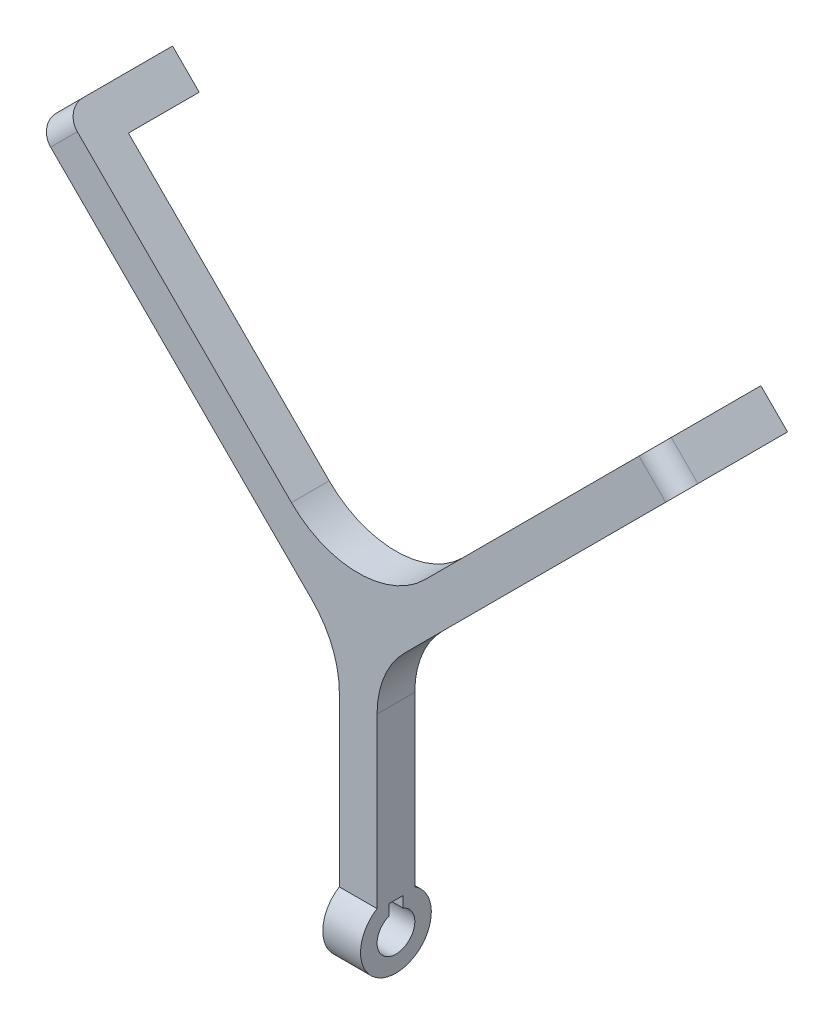
ISO-10303-21;
HEADER;
FILE_DESCRIPTION(('STEP AP214'),'2;1');
FILE_NAME('part.step','',(''),(''),'','','');
FILE_SCHEMA(('AUTOMOTIVE_DESIGN { 1 0 10303 214 1 1 1 1 }'));
ENDSEC;
DATA;
#1=APPLICATION_CONTEXT('core data for automotive mechanical design processes');
#2=APPLICATION_PROTOCOL_DEFINITION('international standard','automotive_design',2000,#1);
#3=PRODUCT_CONTEXT('',#1,'mechanical');
#4=PRODUCT('Part','Part','',(#3));
#5=PRODUCT_RELATED_PRODUCT_CATEGORY('part','',(#4));
#6=PRODUCT_DEFINITION_FORMATION('','',#4);
#7=PRODUCT_DEFINITION_CONTEXT('part definition',#1,'design');
#8=PRODUCT_DEFINITION('design','',#6,#7);
#9=PRODUCT_DEFINITION_SHAPE('','',#8);
#10=(LENGTH_UNIT() NAMED_UNIT(*) SI_UNIT(.MILLI.,.METRE.));
#11=(NAMED_UNIT(*) PLANE_ANGLE_UNIT() SI_UNIT($,.RADIAN.));
#12=(NAMED_UNIT(*) SI_UNIT($,.STERADIAN.) SOLID_ANGLE_UNIT());
#13=UNCERTAINTY_MEASURE_WITH_UNIT(LENGTH_MEASURE(1.E-05),#10,'distance_accuracy_value','');
#14=(GEOMETRIC_REPRESENTATION_CONTEXT(3) GLOBAL_UNCERTAINTY_ASSIGNED_CONTEXT((#13)) GLOBAL_UNIT_ASSIGNED_CONTEXT((#10,
#11,#12)) REPRESENTATION_CONTEXT('',''));
#15=CARTESIAN_POINT('',(0.,0.,0.));
#16=DIRECTION('',(0.,0.,1.));
#17=DIRECTION('',(1.,0.,0.));
#18=AXIS2_PLACEMENT_3D('',#15,#16,#17);
#19=CARTESIAN_POINT('',(0.,0.,0.));
#20=DIRECTION('',(0.,0.,-1.));
#21=DIRECTION('',(-1.,0.,0.));
#22=AXIS2_PLACEMENT_3D('',#19,#20,#21);
#23=PLANE('',#22);
#24=DIRECTION('',(-1.,0.,0.));
#25=VECTOR('',#24,1.);
#26=CARTESIAN_POINT('',(93.2132034355964,6.34428877022476,0.));
#27=LINE('',#26,#25);
#28=CARTESIAN_POINT('',(64.,6.34428877022476,0.));
#29=VERTEX_POINT('',#28);
#30=CARTESIAN_POINT('',(72.,6.34428877022476,0.));
#31=VERTEX_POINT('',#30);
#32=EDGE_CURVE('E245',#29,#31,#27,.F.);
#33=ORIENTED_EDGE('',*,*,#32,.F.);
#34=DIRECTION('',(0.,-1.,0.));
#35=VECTOR('',#34,1.);
#36=CARTESIAN_POINT('',(64.,0.,0.));
#37=LINE('',#36,#35);
#38=CARTESIAN_POINT('',(64.,42.0588745030459,0.));
#39=VERTEX_POINT('',#38);
#40=EDGE_CURVE('E305',#39,#29,#37,.T.);
#41=ORIENTED_EDGE('',*,*,#40,.F.);
#42=CARTESIAN_POINT('',(44.,42.0588745030459,0.));
#43=DIRECTION('',(0.,0.,-1.));
#44=DIRECTION('',(-1.,0.,0.));
#45=AXIS2_PLACEMENT_3D('',#42,#43,#44);
#46=CIRCLE('',#45,20.);
#47=CARTESIAN_POINT('',(58.1421356237309,56.2010101267769,0.));
#48=VERTEX_POINT('',#47);
#49=EDGE_CURVE('E384',#39,#48,#46,.F.);
#50=ORIENTED_EDGE('',*,*,#49,.T.);
#51=DIRECTION('',(0.707106781186549,-0.707106781186546,0.));
#52=VECTOR('',#51,1.);
#53=CARTESIAN_POINT('',(64.,50.3431457505079,0.));
#54=LINE('',#53,#52);
#55=CARTESIAN_POINT('',(5.6568542494924,108.686291501015,0.));
#56=VERTEX_POINT('',#55);
#57=EDGE_CURVE('E335',#56,#48,#54,.T.);
#58=ORIENTED_EDGE('',*,*,#57,.F.);
#59=DIRECTION('',(-0.707106781186547,-0.707106781186548,0.));
#60=VECTOR('',#59,1.);
#61=CARTESIAN_POINT('',(11.3137084989847,114.343145750508,0.));
#62=LINE('',#61,#60);
#63=CARTESIAN_POINT('',(11.3137084989847,114.343145750508,0.));
#64=VERTEX_POINT('',#63);
#65=EDGE_CURVE('E249',#64,#56,#62,.T.);
#66=ORIENTED_EDGE('',*,*,#65,.F.);
#67=DIRECTION('',(-0.707106781186546,0.707106781186549,0.));
#68=VECTOR('',#67,1.);
#69=CARTESIAN_POINT('',(5.65685424949236,120.,0.));
#70=LINE('',#69,#68);
#71=CARTESIAN_POINT('',(53.857864376269,71.7989898732232,0.));
#72=VERTEX_POINT('',#71);
#73=EDGE_CURVE('E332',#72,#64,#70,.T.);
#74=ORIENTED_EDGE('',*,*,#73,.F.);
#75=CARTESIAN_POINT('',(68.,85.9411254969541,0.));
#76=DIRECTION('',(0.,0.,-1.));
#77=DIRECTION('',(-1.,0.,0.));
#78=AXIS2_PLACEMENT_3D('',#75,#76,#77);
#79=CIRCLE('',#78,20.);
#80=CARTESIAN_POINT('',(82.142135623731,71.7989898732232,0.));
#81=VERTEX_POINT('',#80);
#82=EDGE_CURVE('E390',#72,#81,#79,.F.);
#83=ORIENTED_EDGE('',*,*,#82,.T.);
#84=DIRECTION('',(-0.707106781186546,-0.707106781186549,0.));
#85=VECTOR('',#84,1.);
#86=CARTESIAN_POINT('',(68.,57.6568542494922,0.));
#87=LINE('',#86,#85);
#88=CARTESIAN_POINT('',(124.686291501015,114.343145750508,0.));
#89=VERTEX_POINT('',#88);
#90=EDGE_CURVE('E328',#89,#81,#87,.T.);
#91=ORIENTED_EDGE('',*,*,#90,.F.);
#92=DIRECTION('',(-0.70710678118655,0.707106781186545,0.));
#93=VECTOR('',#92,1.);
#94=CARTESIAN_POINT('',(130.343145750508,108.686291501015,0.));
#95=LINE('',#94,#93);
#96=CARTESIAN_POINT('',(130.343145750508,108.686291501015,0.));
#97=VERTEX_POINT('',#96);
#98=EDGE_CURVE('E274',#97,#89,#95,.T.);
#99=ORIENTED_EDGE('',*,*,#98,.F.);
#100=DIRECTION('',(0.707106781186549,0.707106781186546,0.));
#101=VECTOR('',#100,1.);
#102=CARTESIAN_POINT('',(136.,114.343145750508,0.));
#103=LINE('',#102,#101);
#104=CARTESIAN_POINT('',(77.8578643762691,56.2010101267769,0.));
#105=VERTEX_POINT('',#104);
#106=EDGE_CURVE('E325',#105,#97,#103,.T.);
#107=ORIENTED_EDGE('',*,*,#106,.F.);
#108=CARTESIAN_POINT('',(92.,42.0588745030459,0.));
#109=DIRECTION('',(0.,0.,-1.));
#110=DIRECTION('',(-1.,0.,0.));
#111=AXIS2_PLACEMENT_3D('',#108,#109,#110);
#112=CIRCLE('',#111,20.);
#113=CARTESIAN_POINT('',(72.,42.0588745030459,0.));
#114=VERTEX_POINT('',#113);
#115=EDGE_CURVE('E377',#105,#114,#112,.F.);
#116=ORIENTED_EDGE('',*,*,#115,.T.);
#117=DIRECTION('',(0.,1.,0.));
#118=VECTOR('',#117,1.);
#119=CARTESIAN_POINT('',(72.,50.3431457505078,0.));
#120=LINE('',#119,#118);
#121=EDGE_CURVE('E300',#31,#114,#120,.T.);
#122=ORIENTED_EDGE('',*,*,#121,.F.);
#123=EDGE_LOOP('',(#33,#41,#50,#58,#66,#74,#83,#91,#99,#107,#116,#122));
#124=FACE_BOUND('',#123,.T.);
#125=ADVANCED_FACE('F39',(#124),#23,.T.);
#126=CARTESIAN_POINT('',(72.,50.3431457505078,8.));
#127=DIRECTION('',(-1.,0.,0.));
#128=DIRECTION('',(0.,-1.,0.));
#129=AXIS2_PLACEMENT_3D('',#126,#127,#128);
#130=PLANE('',#129);
#131=DIRECTION('',(0.,-1.,0.));
#132=VECTOR('',#131,1.);
#133=CARTESIAN_POINT('',(72.,50.3431457505078,2.50000000000001));
#134=LINE('',#133,#132);
#135=CARTESIAN_POINT('',(72.,6.,2.5));
#136=VERTEX_POINT('',#135);
#137=CARTESIAN_POINT('',(72.,3.70809924354783,2.5));
#138=VERTEX_POINT('',#137);
#139=EDGE_CURVE('E229',#136,#138,#134,.T.);
#140=ORIENTED_EDGE('',*,*,#139,.T.);
#141=CARTESIAN_POINT('',(72.,0.,4.));
#142=DIRECTION('',(-1.,0.,0.));
#143=DIRECTION('',(0.,-1.,0.));
#144=AXIS2_PLACEMENT_3D('',#141,#142,#143);
#145=CIRCLE('',#144,4.);
#146=CARTESIAN_POINT('',(72.,3.70809924354783,5.5));
#147=VERTEX_POINT('',#146);
#148=EDGE_CURVE('E233',#138,#147,#145,.T.);
#149=ORIENTED_EDGE('',*,*,#148,.T.);
#150=DIRECTION('',(0.,1.,0.));
#151=VECTOR('',#150,1.);
#152=CARTESIAN_POINT('',(72.,50.3431457505078,5.5));
#153=LINE('',#152,#151);
#154=CARTESIAN_POINT('',(72.,6.,5.5));
#155=VERTEX_POINT('',#154);
#156=EDGE_CURVE('E220',#147,#155,#153,.T.);
#157=ORIENTED_EDGE('',*,*,#156,.T.);
#158=DIRECTION('',(0.,0.,-1.));
#159=VECTOR('',#158,1.);
#160=CARTESIAN_POINT('',(72.,6.,8.));
#161=LINE('',#160,#159);
#162=EDGE_CURVE('E195',#155,#136,#161,.T.);
#163=ORIENTED_EDGE('',*,*,#162,.T.);
#164=EDGE_LOOP('',(#140,#149,#157,#163));
#165=FACE_BOUND('',#164,.T.);
#166=CARTESIAN_POINT('',(72.,0.,4.));
#167=DIRECTION('',(-1.,0.,0.));
#168=DIRECTION('',(0.,-1.,0.));
#169=AXIS2_PLACEMENT_3D('',#166,#167,#168);
#170=CIRCLE('',#169,7.5);
#171=CARTESIAN_POINT('',(72.,6.34428877022476,8.));
#172=VERTEX_POINT('',#171);
#173=EDGE_CURVE('E241',#172,#31,#170,.F.);
#174=ORIENTED_EDGE('',*,*,#173,.T.);
#175=ORIENTED_EDGE('',*,*,#121,.T.);
#176=DIRECTION('',(0.,0.,-1.));
#177=VECTOR('',#176,1.);
#178=CARTESIAN_POINT('',(72.,42.0588745030459,8.));
#179=LINE('',#178,#177);
#180=CARTESIAN_POINT('',(72.,42.0588745030459,8.));
#181=VERTEX_POINT('',#180);
#182=EDGE_CURVE('E357',#114,#181,#179,.F.);
#183=ORIENTED_EDGE('',*,*,#182,.T.);
#184=DIRECTION('',(0.,1.,0.));
#185=VECTOR('',#184,1.);
#186=CARTESIAN_POINT('',(72.,50.3431457505078,8.));
#187=LINE('',#186,#185);
#188=EDGE_CURVE('E301',#172,#181,#187,.T.);
#189=ORIENTED_EDGE('',*,*,#188,.F.);
#190=EDGE_LOOP('',(#174,#175,#183,#189));
#191=FACE_BOUND('',#190,.T.);
#192=ADVANCED_FACE('F464',(#165,#191),#130,.F.);
#193=CARTESIAN_POINT('',(136.,114.343145750508,8.));
#194=DIRECTION('',(-0.707106781186546,0.707106781186549,0.));
#195=DIRECTION('',(-0.707106781186549,-0.707106781186546,0.));
#196=AXIS2_PLACEMENT_3D('',#193,#194,#195);
#197=PLANE('',#196);
#198=DIRECTION('',(0.,0.,-1.));
#199=VECTOR('',#198,1.);
#200=CARTESIAN_POINT('',(136.,114.343145750508,8.));
#201=LINE('',#200,#199);
#202=CARTESIAN_POINT('',(136.,114.343145750508,4.));
#203=VERTEX_POINT('',#202);
#204=CARTESIAN_POINT('',(136.,114.343145750508,-15.));
#205=VERTEX_POINT('',#204);
#206=EDGE_CURVE('E350',#203,#205,#201,.T.);
#207=ORIENTED_EDGE('',*,*,#206,.F.);
#208=CARTESIAN_POINT('',(133.171572875254,111.514718625761,4.));
#209=DIRECTION('',(-0.707106781186546,0.707106781186549,0.));
#210=DIRECTION('',(-0.707106781186549,-0.707106781186546,0.));
#211=AXIS2_PLACEMENT_3D('',#208,#209,#210);
#212=CIRCLE('',#211,4.);
#213=CARTESIAN_POINT('',(133.171572875254,111.514718625761,8.));
#214=VERTEX_POINT('',#213);
#215=EDGE_CURVE('E410',#203,#214,#212,.F.);
#216=ORIENTED_EDGE('',*,*,#215,.T.);
#217=DIRECTION('',(0.707106781186549,0.707106781186546,0.));
#218=VECTOR('',#217,1.);
#219=CARTESIAN_POINT('',(136.,114.343145750508,8.));
#220=LINE('',#219,#218);
#221=CARTESIAN_POINT('',(77.8578643762691,56.2010101267769,8.));
#222=VERTEX_POINT('',#221);
#223=EDGE_CURVE('E304',#222,#214,#220,.T.);
#224=ORIENTED_EDGE('',*,*,#223,.F.);
#225=DIRECTION('',(0.,0.,-1.));
#226=VECTOR('',#225,1.);
#227=CARTESIAN_POINT('',(77.8578643762691,56.2010101267769,0.));
#228=LINE('',#227,#226);
#229=EDGE_CURVE('E353',#222,#105,#228,.T.);
#230=ORIENTED_EDGE('',*,*,#229,.T.);
#231=ORIENTED_EDGE('',*,*,#106,.T.);
#232=DIRECTION('',(0.,0.,1.));
#233=VECTOR('',#232,1.);
#234=CARTESIAN_POINT('',(130.343145750508,108.686291501015,-15.));
#235=LINE('',#234,#233);
#236=CARTESIAN_POINT('',(130.343145750508,108.686291501015,-15.));
#237=VERTEX_POINT('',#236);
#238=EDGE_CURVE('E296',#237,#97,#235,.T.);
#239=ORIENTED_EDGE('',*,*,#238,.F.);
#240=DIRECTION('',(-0.707106781186552,-0.707106781186543,0.));
#241=VECTOR('',#240,1.);
#242=CARTESIAN_POINT('',(130.343145750508,108.686291501015,-15.));
#243=LINE('',#242,#241);
#244=EDGE_CURVE('E279',#205,#237,#243,.T.);
#245=ORIENTED_EDGE('',*,*,#244,.F.);
#246=EDGE_LOOP('',(#207,#216,#224,#230,#231,#239,#245));
#247=FACE_BOUND('',#246,.T.);
#248=ADVANCED_FACE('F473',(#247),#197,.F.);
#249=CARTESIAN_POINT('',(130.343145750508,120.,8.));
#250=DIRECTION('',(-0.707106781186547,-0.707106781186548,0.));
#251=DIRECTION('',(0.707106781186548,-0.707106781186547,0.));
#252=AXIS2_PLACEMENT_3D('',#249,#250,#251);
#253=PLANE('',#252);
#254=DIRECTION('',(0.,0.,-1.));
#255=VECTOR('',#254,1.);
#256=CARTESIAN_POINT('',(130.343145750508,120.,8.));
#257=LINE('',#256,#255);
#258=CARTESIAN_POINT('',(130.343145750508,120.,4.));
#259=VERTEX_POINT('',#258);
#260=CARTESIAN_POINT('',(130.343145750508,120.,-15.));
#261=VERTEX_POINT('',#260);
#262=EDGE_CURVE('E347',#259,#261,#257,.T.);
#263=ORIENTED_EDGE('',*,*,#262,.F.);
#264=DIRECTION('',(-0.707106781186548,0.707106781186547,0.));
#265=VECTOR('',#264,1.);
#266=CARTESIAN_POINT('',(130.343145750508,120.,4.));
#267=LINE('',#266,#265);
#268=EDGE_CURVE('E407',#259,#203,#267,.F.);
#269=ORIENTED_EDGE('',*,*,#268,.T.);
#270=ORIENTED_EDGE('',*,*,#206,.T.);
#271=DIRECTION('',(0.707106781186548,-0.707106781186547,0.));
#272=VECTOR('',#271,1.);
#273=CARTESIAN_POINT('',(136.,114.343145750508,-15.));
#274=LINE('',#273,#272);
#275=EDGE_CURVE('E275',#261,#205,#274,.T.);
#276=ORIENTED_EDGE('',*,*,#275,.F.);
#277=EDGE_LOOP('',(#263,#269,#270,#276));
#278=FACE_BOUND('',#277,.T.);
#279=ADVANCED_FACE('F490',(#278),#253,.F.);
#280=CARTESIAN_POINT('',(68.,57.6568542494922,8.));
#281=DIRECTION('',(0.707106781186549,-0.707106781186546,0.));
#282=DIRECTION('',(0.707106781186546,0.707106781186549,0.));
#283=AXIS2_PLACEMENT_3D('',#280,#281,#282);
#284=PLANE('',#283);
#285=DIRECTION('',(-0.707106781186546,-0.707106781186549,0.));
#286=VECTOR('',#285,1.);
#287=CARTESIAN_POINT('',(68.,57.6568542494922,8.));
#288=LINE('',#287,#286);
#289=CARTESIAN_POINT('',(127.514718625761,117.171572875254,8.));
#290=VERTEX_POINT('',#289);
#291=CARTESIAN_POINT('',(82.142135623731,71.7989898732232,8.));
#292=VERTEX_POINT('',#291);
#293=EDGE_CURVE('E309',#290,#292,#288,.T.);
#294=ORIENTED_EDGE('',*,*,#293,.F.);
#295=CARTESIAN_POINT('',(127.514718625761,117.171572875254,4.));
#296=DIRECTION('',(0.707106781186549,-0.707106781186546,0.));
#297=DIRECTION('',(0.707106781186546,0.707106781186549,0.));
#298=AXIS2_PLACEMENT_3D('',#295,#296,#297);
#299=CIRCLE('',#298,4.);
#300=EDGE_CURVE('E404',#290,#259,#299,.F.);
#301=ORIENTED_EDGE('',*,*,#300,.T.);
#302=ORIENTED_EDGE('',*,*,#262,.T.);
#303=DIRECTION('',(0.707106781186547,0.707106781186548,0.));
#304=VECTOR('',#303,1.);
#305=CARTESIAN_POINT('',(130.343145750508,120.,-15.));
#306=LINE('',#305,#304);
#307=CARTESIAN_POINT('',(124.686291501015,114.343145750508,-15.));
#308=VERTEX_POINT('',#307);
#309=EDGE_CURVE('E285',#308,#261,#306,.T.);
#310=ORIENTED_EDGE('',*,*,#309,.F.);
#311=DIRECTION('',(0.,0.,1.));
#312=VECTOR('',#311,1.);
#313=CARTESIAN_POINT('',(124.686291501015,114.343145750508,-15.));
#314=LINE('',#313,#312);
#315=EDGE_CURVE('E289',#308,#89,#314,.T.);
#316=ORIENTED_EDGE('',*,*,#315,.T.);
#317=ORIENTED_EDGE('',*,*,#90,.T.);
#318=DIRECTION('',(0.,0.,-1.));
#319=VECTOR('',#318,1.);
#320=CARTESIAN_POINT('',(82.142135623731,71.7989898732232,8.));
#321=LINE('',#320,#319);
#322=EDGE_CURVE('E373',#81,#292,#321,.F.);
#323=ORIENTED_EDGE('',*,*,#322,.T.);
#324=EDGE_LOOP('',(#294,#301,#302,#310,#316,#317,#323));
#325=FACE_BOUND('',#324,.T.);
#326=ADVANCED_FACE('F496',(#325),#284,.F.);
#327=CARTESIAN_POINT('',(5.65685424949236,120.,8.));
#328=DIRECTION('',(-0.707106781186549,-0.707106781186546,0.));
#329=DIRECTION('',(0.707106781186546,-0.707106781186549,0.));
#330=AXIS2_PLACEMENT_3D('',#327,#328,#329);
#331=PLANE('',#330);
#332=DIRECTION('',(0.,0.,-1.));
#333=VECTOR('',#332,1.);
#334=CARTESIAN_POINT('',(5.65685424949236,120.,8.));
#335=LINE('',#334,#333);
#336=CARTESIAN_POINT('',(5.65685424949236,120.,4.));
#337=VERTEX_POINT('',#336);
#338=CARTESIAN_POINT('',(5.65685424949236,120.,-15.));
#339=VERTEX_POINT('',#338);
#340=EDGE_CURVE('E344',#337,#339,#335,.T.);
#341=ORIENTED_EDGE('',*,*,#340,.F.);
#342=CARTESIAN_POINT('',(8.48528137423853,117.171572875254,4.));
#343=DIRECTION('',(-0.707106781186549,-0.707106781186546,0.));
#344=DIRECTION('',(0.707106781186546,-0.707106781186549,0.));
#345=AXIS2_PLACEMENT_3D('',#342,#343,#344);
#346=CIRCLE('',#345,4.);
#347=CARTESIAN_POINT('',(8.48528137423854,117.171572875254,8.));
#348=VERTEX_POINT('',#347);
#349=EDGE_CURVE('E48',#337,#348,#346,.F.);
#350=ORIENTED_EDGE('',*,*,#349,.T.);
#351=DIRECTION('',(-0.707106781186546,0.707106781186549,0.));
#352=VECTOR('',#351,1.);
#353=CARTESIAN_POINT('',(5.65685424949236,120.,8.));
#354=LINE('',#353,#352);
#355=CARTESIAN_POINT('',(53.857864376269,71.7989898732232,8.));
#356=VERTEX_POINT('',#355);
#357=EDGE_CURVE('E312',#356,#348,#354,.T.);
#358=ORIENTED_EDGE('',*,*,#357,.F.);
#359=DIRECTION('',(0.,0.,-1.));
#360=VECTOR('',#359,1.);
#361=CARTESIAN_POINT('',(53.857864376269,71.7989898732232,0.));
#362=LINE('',#361,#360);
#363=EDGE_CURVE('E369',#356,#72,#362,.T.);
#364=ORIENTED_EDGE('',*,*,#363,.T.);
#365=ORIENTED_EDGE('',*,*,#73,.T.);
#366=DIRECTION('',(0.,0.,1.));
#367=VECTOR('',#366,1.);
#368=CARTESIAN_POINT('',(11.3137084989847,114.343145750508,-15.));
#369=LINE('',#368,#367);
#370=CARTESIAN_POINT('',(11.3137084989847,114.343145750508,-15.));
#371=VERTEX_POINT('',#370);
#372=EDGE_CURVE('E270',#371,#64,#369,.T.);
#373=ORIENTED_EDGE('',*,*,#372,.F.);
#374=DIRECTION('',(0.707106781186546,-0.707106781186549,0.));
#375=VECTOR('',#374,1.);
#376=CARTESIAN_POINT('',(11.3137084989847,114.343145750508,-15.));
#377=LINE('',#376,#375);
#378=EDGE_CURVE('E254',#339,#371,#377,.T.);
#379=ORIENTED_EDGE('',*,*,#378,.F.);
#380=EDGE_LOOP('',(#341,#350,#358,#364,#365,#373,#379));
#381=FACE_BOUND('',#380,.T.);
#382=ADVANCED_FACE('F423',(#381),#331,.F.);
#383=CARTESIAN_POINT('',(0.,114.343145750508,8.));
#384=DIRECTION('',(0.707106781186549,-0.707106781186546,0.));
#385=DIRECTION('',(0.707106781186546,0.707106781186549,0.));
#386=AXIS2_PLACEMENT_3D('',#383,#384,#385);
#387=PLANE('',#386);
#388=DIRECTION('',(0.,0.,-1.));
#389=VECTOR('',#388,1.);
#390=CARTESIAN_POINT('',(0.,114.343145750508,8.));
#391=LINE('',#390,#389);
#392=CARTESIAN_POINT('',(0.,114.343145750508,4.));
#393=VERTEX_POINT('',#392);
#394=CARTESIAN_POINT('',(0.,114.343145750508,-15.));
#395=VERTEX_POINT('',#394);
#396=EDGE_CURVE('E322',#393,#395,#391,.T.);
#397=ORIENTED_EDGE('',*,*,#396,.F.);
#398=DIRECTION('',(-0.707106781186546,-0.707106781186549,0.));
#399=VECTOR('',#398,1.);
#400=CARTESIAN_POINT('',(0.,114.343145750508,4.));
#401=LINE('',#400,#399);
#402=EDGE_CURVE('E416',#393,#337,#401,.F.);
#403=ORIENTED_EDGE('',*,*,#402,.T.);
#404=ORIENTED_EDGE('',*,*,#340,.T.);
#405=DIRECTION('',(0.707106781186546,0.707106781186549,0.));
#406=VECTOR('',#405,1.);
#407=CARTESIAN_POINT('',(5.65685424949236,120.,-15.));
#408=LINE('',#407,#406);
#409=EDGE_CURVE('E250',#395,#339,#408,.T.);
#410=ORIENTED_EDGE('',*,*,#409,.F.);
#411=EDGE_LOOP('',(#397,#403,#404,#410));
#412=FACE_BOUND('',#411,.T.);
#413=ADVANCED_FACE('F439',(#412),#387,.F.);
#414=CARTESIAN_POINT('',(64.,50.3431457505079,8.));
#415=DIRECTION('',(0.707106781186546,0.707106781186549,0.));
#416=DIRECTION('',(-0.707106781186549,0.707106781186546,0.));
#417=AXIS2_PLACEMENT_3D('',#414,#415,#416);
#418=PLANE('',#417);
#419=DIRECTION('',(0.707106781186549,-0.707106781186546,0.));
#420=VECTOR('',#419,1.);
#421=CARTESIAN_POINT('',(64.,50.3431457505079,8.));
#422=LINE('',#421,#420);
#423=CARTESIAN_POINT('',(2.8284271247462,111.514718625761,8.));
#424=VERTEX_POINT('',#423);
#425=CARTESIAN_POINT('',(58.1421356237309,56.2010101267769,8.));
#426=VERTEX_POINT('',#425);
#427=EDGE_CURVE('E316',#424,#426,#422,.T.);
#428=ORIENTED_EDGE('',*,*,#427,.F.);
#429=CARTESIAN_POINT('',(2.82842712474617,111.514718625761,4.));
#430=DIRECTION('',(0.707106781186546,0.707106781186549,0.));
#431=DIRECTION('',(-0.707106781186549,0.707106781186546,0.));
#432=AXIS2_PLACEMENT_3D('',#429,#430,#431);
#433=CIRCLE('',#432,4.);
#434=EDGE_CURVE('E413',#424,#393,#433,.F.);
#435=ORIENTED_EDGE('',*,*,#434,.T.);
#436=ORIENTED_EDGE('',*,*,#396,.T.);
#437=DIRECTION('',(-0.707106781186549,0.707106781186546,0.));
#438=VECTOR('',#437,1.);
#439=CARTESIAN_POINT('',(0.,114.343145750508,-15.));
#440=LINE('',#439,#438);
#441=CARTESIAN_POINT('',(5.65685424949238,108.686291501015,-15.));
#442=VERTEX_POINT('',#441);
#443=EDGE_CURVE('E260',#442,#395,#440,.T.);
#444=ORIENTED_EDGE('',*,*,#443,.F.);
#445=DIRECTION('',(0.,0.,1.));
#446=VECTOR('',#445,1.);
#447=CARTESIAN_POINT('',(5.65685424949238,108.686291501015,-15.));
#448=LINE('',#447,#446);
#449=EDGE_CURVE('E264',#442,#56,#448,.T.);
#450=ORIENTED_EDGE('',*,*,#449,.T.);
#451=ORIENTED_EDGE('',*,*,#57,.T.);
#452=DIRECTION('',(0.,0.,-1.));
#453=VECTOR('',#452,1.);
#454=CARTESIAN_POINT('',(58.1421356237309,56.2010101267769,8.));
#455=LINE('',#454,#453);
#456=EDGE_CURVE('E365',#48,#426,#455,.F.);
#457=ORIENTED_EDGE('',*,*,#456,.T.);
#458=EDGE_LOOP('',(#428,#435,#436,#444,#450,#451,#457));
#459=FACE_BOUND('',#458,.T.);
#460=ADVANCED_FACE('F435',(#459),#418,.F.);
#461=CARTESIAN_POINT('',(64.,0.,8.));
#462=DIRECTION('',(1.,0.,0.));
#463=DIRECTION('',(0.,0.,-1.));
#464=AXIS2_PLACEMENT_3D('',#461,#462,#463);
#465=PLANE('',#464);
#466=DIRECTION('',(0.,1.,0.));
#467=VECTOR('',#466,1.);
#468=CARTESIAN_POINT('',(64.,3.70809924354783,5.5));
#469=LINE('',#468,#467);
#470=CARTESIAN_POINT('',(64.,3.70809924354783,5.5));
#471=VERTEX_POINT('',#470);
#472=CARTESIAN_POINT('',(64.,6.,5.5));
#473=VERTEX_POINT('',#472);
#474=EDGE_CURVE('E202',#471,#473,#469,.T.);
#475=ORIENTED_EDGE('',*,*,#474,.F.);
#476=CARTESIAN_POINT('',(64.,0.,4.));
#477=DIRECTION('',(-1.,0.,0.));
#478=DIRECTION('',(0.,0.,1.));
#479=AXIS2_PLACEMENT_3D('',#476,#477,#478);
#480=CIRCLE('',#479,4.);
#481=CARTESIAN_POINT('',(64.,3.70809924354783,2.5));
#482=VERTEX_POINT('',#481);
#483=EDGE_CURVE('E63',#482,#471,#480,.T.);
#484=ORIENTED_EDGE('',*,*,#483,.F.);
#485=DIRECTION('',(0.,-1.,0.));
#486=VECTOR('',#485,1.);
#487=CARTESIAN_POINT('',(64.,3.70809924354783,2.5));
#488=LINE('',#487,#486);
#489=CARTESIAN_POINT('',(64.,6.,2.5));
#490=VERTEX_POINT('',#489);
#491=EDGE_CURVE('E210',#490,#482,#488,.T.);
#492=ORIENTED_EDGE('',*,*,#491,.F.);
#493=DIRECTION('',(0.,0.,-1.));
#494=VECTOR('',#493,1.);
#495=CARTESIAN_POINT('',(64.,6.,2.5));
#496=LINE('',#495,#494);
#497=EDGE_CURVE('E192',#473,#490,#496,.T.);
#498=ORIENTED_EDGE('',*,*,#497,.F.);
#499=EDGE_LOOP('',(#475,#484,#492,#498));
#500=FACE_BOUND('',#499,.T.);
#501=ORIENTED_EDGE('',*,*,#40,.T.);
#502=CARTESIAN_POINT('',(64.,0.,4.));
#503=DIRECTION('',(-1.,0.,0.));
#504=DIRECTION('',(0.,0.,1.));
#505=AXIS2_PLACEMENT_3D('',#502,#503,#504);
#506=CIRCLE('',#505,7.5);
#507=CARTESIAN_POINT('',(64.,6.34428877022476,8.));
#508=VERTEX_POINT('',#507);
#509=EDGE_CURVE('E237',#29,#508,#506,.T.);
#510=ORIENTED_EDGE('',*,*,#509,.T.);
#511=DIRECTION('',(0.,-1.,0.));
#512=VECTOR('',#511,1.);
#513=CARTESIAN_POINT('',(64.,0.,8.));
#514=LINE('',#513,#512);
#515=CARTESIAN_POINT('',(64.,42.0588745030459,8.));
#516=VERTEX_POINT('',#515);
#517=EDGE_CURVE('E319',#516,#508,#514,.T.);
#518=ORIENTED_EDGE('',*,*,#517,.F.);
#519=DIRECTION('',(0.,0.,-1.));
#520=VECTOR('',#519,1.);
#521=CARTESIAN_POINT('',(64.,42.0588745030459,0.));
#522=LINE('',#521,#520);
#523=EDGE_CURVE('E361',#516,#39,#522,.T.);
#524=ORIENTED_EDGE('',*,*,#523,.T.);
#525=EDGE_LOOP('',(#501,#510,#518,#524));
#526=FACE_BOUND('',#525,.T.);
#527=ADVANCED_FACE('F207',(#500,#526),#465,.F.);
#528=CARTESIAN_POINT('',(0.,0.,8.));
#529=DIRECTION('',(0.,0.,-1.));
#530=DIRECTION('',(-1.,0.,0.));
#531=AXIS2_PLACEMENT_3D('',#528,#529,#530);
#532=PLANE('',#531);
#533=ORIENTED_EDGE('',*,*,#517,.T.);
#534=DIRECTION('',(-1.,0.,0.));
#535=VECTOR('',#534,1.);
#536=CARTESIAN_POINT('',(93.2132034355964,6.34428877022476,8.));
#537=LINE('',#536,#535);
#538=EDGE_CURVE('E11',#508,#172,#537,.F.);
#539=ORIENTED_EDGE('',*,*,#538,.T.);
#540=ORIENTED_EDGE('',*,*,#188,.T.);
#541=CARTESIAN_POINT('',(92.,42.0588745030459,8.));
#542=DIRECTION('',(0.,0.,-1.));
#543=DIRECTION('',(-1.,0.,0.));
#544=AXIS2_PLACEMENT_3D('',#541,#542,#543);
#545=CIRCLE('',#544,20.);
#546=EDGE_CURVE('E381',#181,#222,#545,.T.);
#547=ORIENTED_EDGE('',*,*,#546,.T.);
#548=ORIENTED_EDGE('',*,*,#223,.T.);
#549=DIRECTION('',(-0.707106781186548,0.707106781186547,0.));
#550=VECTOR('',#549,1.);
#551=CARTESIAN_POINT('',(122.343145750507,122.343145750508,8.));
#552=LINE('',#551,#550);
#553=EDGE_CURVE('E400',#214,#290,#552,.T.);
#554=ORIENTED_EDGE('',*,*,#553,.T.);
#555=ORIENTED_EDGE('',*,*,#293,.T.);
#556=CARTESIAN_POINT('',(68.,85.9411254969541,8.));
#557=DIRECTION('',(0.,0.,-1.));
#558=DIRECTION('',(-1.,0.,0.));
#559=AXIS2_PLACEMENT_3D('',#556,#557,#558);
#560=CIRCLE('',#559,20.);
#561=EDGE_CURVE('E393',#292,#356,#560,.T.);
#562=ORIENTED_EDGE('',*,*,#561,.T.);
#563=ORIENTED_EDGE('',*,*,#357,.T.);
#564=DIRECTION('',(-0.707106781186546,-0.707106781186549,0.));
#565=VECTOR('',#564,1.);
#566=CARTESIAN_POINT('',(-54.3431457505076,54.3431457505074,8.));
#567=LINE('',#566,#565);
#568=EDGE_CURVE('E396',#348,#424,#567,.T.);
#569=ORIENTED_EDGE('',*,*,#568,.T.);
#570=ORIENTED_EDGE('',*,*,#427,.T.);
#571=CARTESIAN_POINT('',(44.,42.0588745030459,8.));
#572=DIRECTION('',(0.,0.,-1.));
#573=DIRECTION('',(-1.,0.,0.));
#574=AXIS2_PLACEMENT_3D('',#571,#572,#573);
#575=CIRCLE('',#574,20.);
#576=EDGE_CURVE('E387',#426,#516,#575,.T.);
#577=ORIENTED_EDGE('',*,*,#576,.T.);
#578=EDGE_LOOP('',(#533,#539,#540,#547,#548,#554,#555,#562,#563,#569,#570,#577));
#579=FACE_BOUND('',#578,.T.);
#580=ADVANCED_FACE('F430',(#579),#532,.F.);
#581=CARTESIAN_POINT('',(130.343145750508,108.686291501015,-15.));
#582=DIRECTION('',(0.707106781186545,0.70710678118655,0.));
#583=DIRECTION('',(-0.70710678118655,0.707106781186545,0.));
#584=AXIS2_PLACEMENT_3D('',#581,#582,#583);
#585=PLANE('',#584);
#586=ORIENTED_EDGE('',*,*,#98,.T.);
#587=ORIENTED_EDGE('',*,*,#315,.F.);
#588=DIRECTION('',(-0.70710678118655,0.707106781186545,0.));
#589=VECTOR('',#588,1.);
#590=CARTESIAN_POINT('',(130.343145750508,108.686291501015,-15.));
#591=LINE('',#590,#589);
#592=EDGE_CURVE('E282',#237,#308,#591,.T.);
#593=ORIENTED_EDGE('',*,*,#592,.F.);
#594=ORIENTED_EDGE('',*,*,#238,.T.);
#595=EDGE_LOOP('',(#586,#587,#593,#594));
#596=FACE_BOUND('',#595,.T.);
#597=ADVANCED_FACE('F483',(#596),#585,.F.);
#598=CARTESIAN_POINT('',(0.,0.,-15.));
#599=DIRECTION('',(0.,0.,1.));
#600=DIRECTION('',(1.,0.,0.));
#601=AXIS2_PLACEMENT_3D('',#598,#599,#600);
#602=PLANE('',#601);
#603=ORIENTED_EDGE('',*,*,#275,.T.);
#604=ORIENTED_EDGE('',*,*,#244,.T.);
#605=ORIENTED_EDGE('',*,*,#592,.T.);
#606=ORIENTED_EDGE('',*,*,#309,.T.);
#607=EDGE_LOOP('',(#603,#604,#605,#606));
#608=FACE_BOUND('',#607,.T.);
#609=ADVANCED_FACE('F486',(#608),#602,.F.);
#610=CARTESIAN_POINT('',(11.3137084989847,114.343145750508,-15.));
#611=DIRECTION('',(-0.707106781186548,0.707106781186547,0.));
#612=DIRECTION('',(-0.707106781186547,-0.707106781186548,0.));
#613=AXIS2_PLACEMENT_3D('',#610,#611,#612);
#614=PLANE('',#613);
#615=ORIENTED_EDGE('',*,*,#65,.T.);
#616=ORIENTED_EDGE('',*,*,#449,.F.);
#617=DIRECTION('',(-0.707106781186547,-0.707106781186548,0.));
#618=VECTOR('',#617,1.);
#619=CARTESIAN_POINT('',(11.3137084989847,114.343145750508,-15.));
#620=LINE('',#619,#618);
#621=EDGE_CURVE('E257',#371,#442,#620,.T.);
#622=ORIENTED_EDGE('',*,*,#621,.F.);
#623=ORIENTED_EDGE('',*,*,#372,.T.);
#624=EDGE_LOOP('',(#615,#616,#622,#623));
#625=FACE_BOUND('',#624,.T.);
#626=ADVANCED_FACE('F449',(#625),#614,.F.);
#627=CARTESIAN_POINT('',(0.,0.,-15.));
#628=DIRECTION('',(0.,0.,1.));
#629=DIRECTION('',(1.,0.,0.));
#630=AXIS2_PLACEMENT_3D('',#627,#628,#629);
#631=PLANE('',#630);
#632=ORIENTED_EDGE('',*,*,#409,.T.);
#633=ORIENTED_EDGE('',*,*,#378,.T.);
#634=ORIENTED_EDGE('',*,*,#621,.T.);
#635=ORIENTED_EDGE('',*,*,#443,.T.);
#636=EDGE_LOOP('',(#632,#633,#634,#635));
#637=FACE_BOUND('',#636,.T.);
#638=ADVANCED_FACE('F441',(#637),#631,.F.);
#639=CARTESIAN_POINT('',(92.,42.0588745030459,8.));
#640=DIRECTION('',(0.,0.,1.));
#641=DIRECTION('',(1.,0.,0.));
#642=AXIS2_PLACEMENT_3D('',#639,#640,#641);
#643=CYLINDRICAL_SURFACE('',#642,20.);
#644=ORIENTED_EDGE('',*,*,#546,.F.);
#645=ORIENTED_EDGE('',*,*,#182,.F.);
#646=ORIENTED_EDGE('',*,*,#115,.F.);
#647=ORIENTED_EDGE('',*,*,#229,.F.);
#648=EDGE_LOOP('',(#644,#645,#646,#647));
#649=FACE_BOUND('',#648,.T.);
#650=ADVANCED_FACE('F476',(#649),#643,.F.);
#651=CARTESIAN_POINT('',(44.,42.0588745030459,8.));
#652=DIRECTION('',(0.,0.,1.));
#653=DIRECTION('',(1.,0.,0.));
#654=AXIS2_PLACEMENT_3D('',#651,#652,#653);
#655=CYLINDRICAL_SURFACE('',#654,20.);
#656=ORIENTED_EDGE('',*,*,#576,.F.);
#657=ORIENTED_EDGE('',*,*,#456,.F.);
#658=ORIENTED_EDGE('',*,*,#49,.F.);
#659=ORIENTED_EDGE('',*,*,#523,.F.);
#660=EDGE_LOOP('',(#656,#657,#658,#659));
#661=FACE_BOUND('',#660,.T.);
#662=ADVANCED_FACE('F456',(#661),#655,.F.);
#663=CARTESIAN_POINT('',(68.,85.9411254969541,8.));
#664=DIRECTION('',(0.,0.,1.));
#665=DIRECTION('',(1.,0.,0.));
#666=AXIS2_PLACEMENT_3D('',#663,#664,#665);
#667=CYLINDRICAL_SURFACE('',#666,20.);
#668=ORIENTED_EDGE('',*,*,#561,.F.);
#669=ORIENTED_EDGE('',*,*,#322,.F.);
#670=ORIENTED_EDGE('',*,*,#82,.F.);
#671=ORIENTED_EDGE('',*,*,#363,.F.);
#672=EDGE_LOOP('',(#668,#669,#670,#671));
#673=FACE_BOUND('',#672,.T.);
#674=ADVANCED_FACE('F499',(#673),#667,.F.);
#675=CARTESIAN_POINT('',(122.343145750507,122.343145750508,4.));
#676=DIRECTION('',(-0.707106781186548,0.707106781186547,0.));
#677=DIRECTION('',(-0.707106781186547,-0.707106781186548,0.));
#678=AXIS2_PLACEMENT_3D('',#675,#676,#677);
#679=CYLINDRICAL_SURFACE('',#678,4.);
#680=ORIENTED_EDGE('',*,*,#215,.F.);
#681=ORIENTED_EDGE('',*,*,#268,.F.);
#682=ORIENTED_EDGE('',*,*,#300,.F.);
#683=ORIENTED_EDGE('',*,*,#553,.F.);
#684=EDGE_LOOP('',(#680,#681,#682,#683));
#685=FACE_BOUND('',#684,.T.);
#686=ADVANCED_FACE('F493',(#685),#679,.T.);
#687=CARTESIAN_POINT('',(-54.3431457505076,54.3431457505074,4.));
#688=DIRECTION('',(-0.707106781186546,-0.707106781186549,0.));
#689=DIRECTION('',(0.707106781186549,-0.707106781186546,0.));
#690=AXIS2_PLACEMENT_3D('',#687,#688,#689);
#691=CYLINDRICAL_SURFACE('',#690,4.);
#692=ORIENTED_EDGE('',*,*,#349,.F.);
#693=ORIENTED_EDGE('',*,*,#402,.F.);
#694=ORIENTED_EDGE('',*,*,#434,.F.);
#695=ORIENTED_EDGE('',*,*,#568,.F.);
#696=EDGE_LOOP('',(#692,#693,#694,#695));
#697=FACE_BOUND('',#696,.T.);
#698=ADVANCED_FACE('F41',(#697),#691,.T.);
#699=CARTESIAN_POINT('',(93.2132034355964,0.,4.));
#700=DIRECTION('',(-1.,0.,0.));
#701=DIRECTION('',(0.,0.,1.));
#702=AXIS2_PLACEMENT_3D('',#699,#700,#701);
#703=CYLINDRICAL_SURFACE('',#702,7.5);
#704=ORIENTED_EDGE('',*,*,#509,.F.);
#705=ORIENTED_EDGE('',*,*,#32,.T.);
#706=ORIENTED_EDGE('',*,*,#173,.F.);
#707=ORIENTED_EDGE('',*,*,#538,.F.);
#708=EDGE_LOOP('',(#704,#705,#706,#707));
#709=FACE_BOUND('',#708,.T.);
#710=ADVANCED_FACE('F462',(#709),#703,.T.);
#711=CARTESIAN_POINT('',(136.,0.,4.));
#712=DIRECTION('',(-1.,0.,0.));
#713=DIRECTION('',(0.,0.,1.));
#714=AXIS2_PLACEMENT_3D('',#711,#712,#713);
#715=CYLINDRICAL_SURFACE('',#714,4.);
#716=DIRECTION('',(-1.,0.,0.));
#717=VECTOR('',#716,1.);
#718=CARTESIAN_POINT('',(136.,3.70809924354783,2.5));
#719=LINE('',#718,#717);
#720=EDGE_CURVE('E217',#138,#482,#719,.T.);
#721=ORIENTED_EDGE('',*,*,#720,.T.);
#722=ORIENTED_EDGE('',*,*,#483,.T.);
#723=DIRECTION('',(-1.,0.,0.));
#724=VECTOR('',#723,1.);
#725=CARTESIAN_POINT('',(136.,3.70809924354783,5.5));
#726=LINE('',#725,#724);
#727=EDGE_CURVE('E199',#147,#471,#726,.T.);
#728=ORIENTED_EDGE('',*,*,#727,.F.);
#729=ORIENTED_EDGE('',*,*,#148,.F.);
#730=EDGE_LOOP('',(#721,#722,#728,#729));
#731=FACE_BOUND('',#730,.T.);
#732=ADVANCED_FACE('F594',(#731),#715,.F.);
#733=CARTESIAN_POINT('',(136.,3.70809924354783,2.5));
#734=DIRECTION('',(0.,0.,-1.));
#735=DIRECTION('',(0.,1.,0.));
#736=AXIS2_PLACEMENT_3D('',#733,#734,#735);
#737=PLANE('',#736);
#738=DIRECTION('',(-1.,0.,0.));
#739=VECTOR('',#738,1.);
#740=CARTESIAN_POINT('',(136.,6.,2.5));
#741=LINE('',#740,#739);
#742=EDGE_CURVE('E198',#136,#490,#741,.T.);
#743=ORIENTED_EDGE('',*,*,#742,.T.);
#744=ORIENTED_EDGE('',*,*,#491,.T.);
#745=ORIENTED_EDGE('',*,*,#720,.F.);
#746=ORIENTED_EDGE('',*,*,#139,.F.);
#747=EDGE_LOOP('',(#743,#744,#745,#746));
#748=FACE_BOUND('',#747,.T.);
#749=ADVANCED_FACE('F605',(#748),#737,.F.);
#750=CARTESIAN_POINT('',(136.,6.,2.5));
#751=DIRECTION('',(0.,1.,0.));
#752=DIRECTION('',(0.,0.,1.));
#753=AXIS2_PLACEMENT_3D('',#750,#751,#752);
#754=PLANE('',#753);
#755=DIRECTION('',(-1.,0.,0.));
#756=VECTOR('',#755,1.);
#757=CARTESIAN_POINT('',(136.,6.,5.5));
#758=LINE('',#757,#756);
#759=EDGE_CURVE('E55',#155,#473,#758,.T.);
#760=ORIENTED_EDGE('',*,*,#759,.T.);
#761=ORIENTED_EDGE('',*,*,#497,.T.);
#762=ORIENTED_EDGE('',*,*,#742,.F.);
#763=ORIENTED_EDGE('',*,*,#162,.F.);
#764=EDGE_LOOP('',(#760,#761,#762,#763));
#765=FACE_BOUND('',#764,.T.);
#766=ADVANCED_FACE('F189',(#765),#754,.F.);
#767=CARTESIAN_POINT('',(136.,3.70809924354783,5.5));
#768=DIRECTION('',(0.,0.,1.));
#769=DIRECTION('',(1.,0.,0.));
#770=AXIS2_PLACEMENT_3D('',#767,#768,#769);
#771=PLANE('',#770);
#772=ORIENTED_EDGE('',*,*,#727,.T.);
#773=ORIENTED_EDGE('',*,*,#474,.T.);
#774=ORIENTED_EDGE('',*,*,#759,.F.);
#775=ORIENTED_EDGE('',*,*,#156,.F.);
#776=EDGE_LOOP('',(#772,#773,#774,#775));
#777=FACE_BOUND('',#776,.T.);
#778=ADVANCED_FACE('F203',(#777),#771,.F.);
#779=CLOSED_SHELL('',(#125,#192,#248,#279,#326,#382,#413,#460,#527,#580,#597,#609,#626,#638,
#650,#662,#674,#686,#698,#710,#732,#749,#766,#778));
#780=MANIFOLD_SOLID_BREP('B2',#779);
#781=ADVANCED_BREP_SHAPE_REPRESENTATION('',(#18,#780),#14);
#782=SHAPE_DEFINITION_REPRESENTATION(#9,#781);
ENDSEC;
END-ISO-10303-21;
